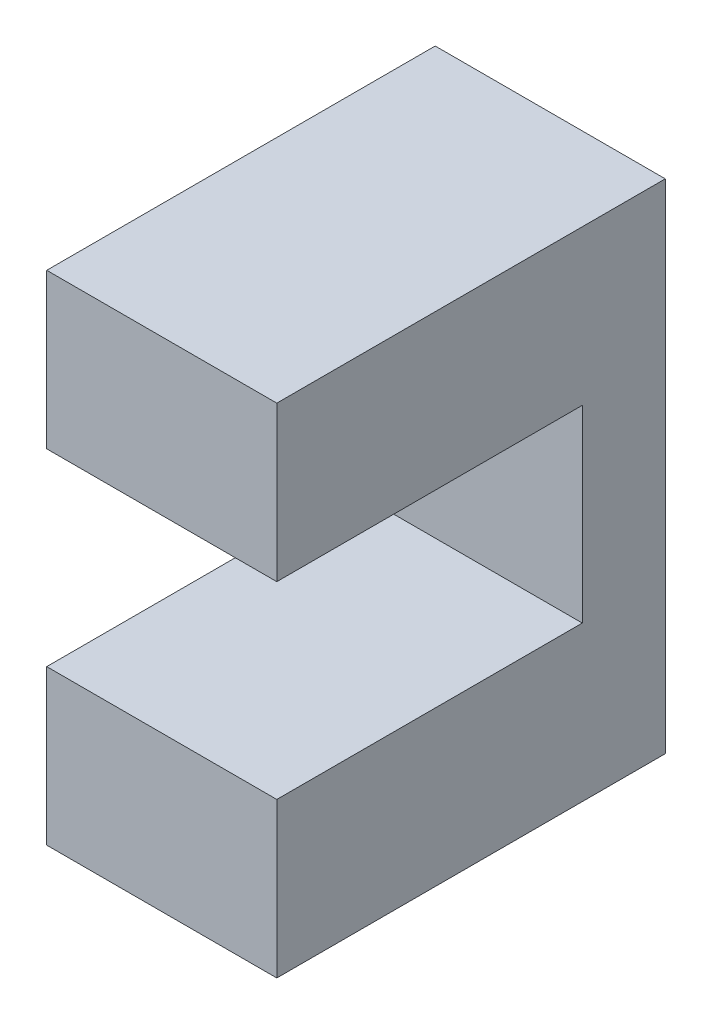
ISO-10303-21;
HEADER;
FILE_DESCRIPTION(('STEP AP214'),'2;1');
FILE_NAME('part.step','',(''),(''),'','','');
FILE_SCHEMA(('AUTOMOTIVE_DESIGN { 1 0 10303 214 1 1 1 1 }'));
ENDSEC;
DATA;
#1=APPLICATION_CONTEXT('core data for automotive mechanical design processes');
#2=APPLICATION_PROTOCOL_DEFINITION('international standard','automotive_design',2000,#1);
#3=PRODUCT_CONTEXT('',#1,'mechanical');
#4=PRODUCT('Part','Part','',(#3));
#5=PRODUCT_RELATED_PRODUCT_CATEGORY('part','',(#4));
#6=PRODUCT_DEFINITION_FORMATION('','',#4);
#7=PRODUCT_DEFINITION_CONTEXT('part definition',#1,'design');
#8=PRODUCT_DEFINITION('design','',#6,#7);
#9=PRODUCT_DEFINITION_SHAPE('','',#8);
#10=(LENGTH_UNIT() NAMED_UNIT(*) SI_UNIT(.MILLI.,.METRE.));
#11=(NAMED_UNIT(*) PLANE_ANGLE_UNIT() SI_UNIT($,.RADIAN.));
#12=(NAMED_UNIT(*) SI_UNIT($,.STERADIAN.) SOLID_ANGLE_UNIT());
#13=UNCERTAINTY_MEASURE_WITH_UNIT(LENGTH_MEASURE(1.E-05),#10,'distance_accuracy_value','');
#14=(GEOMETRIC_REPRESENTATION_CONTEXT(3) GLOBAL_UNCERTAINTY_ASSIGNED_CONTEXT((#13)) GLOBAL_UNIT_ASSIGNED_CONTEXT((#10,
#11,#12)) REPRESENTATION_CONTEXT('',''));
#15=CARTESIAN_POINT('',(0.,0.,0.));
#16=DIRECTION('',(0.,0.,1.));
#17=DIRECTION('',(1.,0.,0.));
#18=AXIS2_PLACEMENT_3D('',#15,#16,#17);
#19=CARTESIAN_POINT('',(-8.59,-6.61,0.));
#20=DIRECTION('',(0.,0.,-1.));
#21=DIRECTION('',(-1.,0.,0.));
#22=AXIS2_PLACEMENT_3D('',#19,#20,#21);
#23=PLANE('',#22);
#24=DIRECTION('',(0.,1.,0.));
#25=VECTOR('',#24,1.);
#26=CARTESIAN_POINT('',(-8.6,0.,0.));
#27=LINE('',#26,#25);
#28=CARTESIAN_POINT('',(-8.6,-6.6,0.));
#29=VERTEX_POINT('',#28);
#30=CARTESIAN_POINT('',(-8.6,6.6,0.));
#31=VERTEX_POINT('',#30);
#32=EDGE_CURVE('E80',#29,#31,#27,.T.);
#33=ORIENTED_EDGE('',*,*,#32,.F.);
#34=DIRECTION('',(1.,0.,0.));
#35=VECTOR('',#34,1.);
#36=CARTESIAN_POINT('',(-11.65,-6.6,0.));
#37=LINE('',#36,#35);
#38=CARTESIAN_POINT('',(-14.7,-6.6,0.));
#39=VERTEX_POINT('',#38);
#40=EDGE_CURVE('E21',#39,#29,#37,.T.);
#41=ORIENTED_EDGE('',*,*,#40,.F.);
#42=DIRECTION('',(0.,-1.,0.));
#43=VECTOR('',#42,1.);
#44=CARTESIAN_POINT('',(-14.7,0.,0.));
#45=LINE('',#44,#43);
#46=CARTESIAN_POINT('',(-14.7,6.6,0.));
#47=VERTEX_POINT('',#46);
#48=EDGE_CURVE('E86',#47,#39,#45,.T.);
#49=ORIENTED_EDGE('',*,*,#48,.F.);
#50=DIRECTION('',(-1.,0.,0.));
#51=VECTOR('',#50,1.);
#52=CARTESIAN_POINT('',(-11.65,6.6,0.));
#53=LINE('',#52,#51);
#54=EDGE_CURVE('E83',#31,#47,#53,.T.);
#55=ORIENTED_EDGE('',*,*,#54,.F.);
#56=EDGE_LOOP('',(#33,#41,#49,#55));
#57=FACE_BOUND('',#56,.T.);
#58=ADVANCED_FACE('F17',(#57),#23,.T.);
#59=CARTESIAN_POINT('',(-14.71,-6.6,-0.01));
#60=DIRECTION('',(0.,-1.,0.));
#61=DIRECTION('',(1.,0.,0.));
#62=AXIS2_PLACEMENT_3D('',#59,#60,#61);
#63=PLANE('',#62);
#64=DIRECTION('',(1.,0.,0.));
#65=VECTOR('',#64,1.);
#66=CARTESIAN_POINT('',(-11.65,-6.6,10.3));
#67=LINE('',#66,#65);
#68=CARTESIAN_POINT('',(-14.7,-6.6,10.3));
#69=VERTEX_POINT('',#68);
#70=CARTESIAN_POINT('',(-8.6,-6.6,10.3));
#71=VERTEX_POINT('',#70);
#72=EDGE_CURVE('E103',#69,#71,#67,.T.);
#73=ORIENTED_EDGE('',*,*,#72,.F.);
#74=DIRECTION('',(0.,0.,1.));
#75=VECTOR('',#74,1.);
#76=CARTESIAN_POINT('',(-14.7,-6.6,5.15));
#77=LINE('',#76,#75);
#78=EDGE_CURVE('E118',#39,#69,#77,.T.);
#79=ORIENTED_EDGE('',*,*,#78,.F.);
#80=ORIENTED_EDGE('',*,*,#40,.T.);
#81=DIRECTION('',(0.,0.,-1.));
#82=VECTOR('',#81,1.);
#83=CARTESIAN_POINT('',(-8.6,-6.6,5.15));
#84=LINE('',#83,#82);
#85=EDGE_CURVE('E102',#71,#29,#84,.T.);
#86=ORIENTED_EDGE('',*,*,#85,.F.);
#87=EDGE_LOOP('',(#73,#79,#80,#86));
#88=FACE_BOUND('',#87,.T.);
#89=ADVANCED_FACE('F158',(#88),#63,.T.);
#90=CARTESIAN_POINT('',(-14.71,2.49,10.3));
#91=DIRECTION('',(0.,0.,1.));
#92=DIRECTION('',(1.,0.,0.));
#93=AXIS2_PLACEMENT_3D('',#90,#91,#92);
#94=PLANE('',#93);
#95=DIRECTION('',(0.,-1.,0.));
#96=VECTOR('',#95,1.);
#97=CARTESIAN_POINT('',(-8.6,0.,10.3));
#98=LINE('',#97,#96);
#99=CARTESIAN_POINT('',(-8.6,6.6,10.3));
#100=VERTEX_POINT('',#99);
#101=CARTESIAN_POINT('',(-8.6,2.5,10.3));
#102=VERTEX_POINT('',#101);
#103=EDGE_CURVE('E96',#100,#102,#98,.T.);
#104=ORIENTED_EDGE('',*,*,#103,.F.);
#105=DIRECTION('',(1.,0.,0.));
#106=VECTOR('',#105,1.);
#107=CARTESIAN_POINT('',(-11.65,6.6,10.3));
#108=LINE('',#107,#106);
#109=CARTESIAN_POINT('',(-14.7,6.6,10.3));
#110=VERTEX_POINT('',#109);
#111=EDGE_CURVE('E90',#110,#100,#108,.T.);
#112=ORIENTED_EDGE('',*,*,#111,.F.);
#113=DIRECTION('',(0.,1.,0.));
#114=VECTOR('',#113,1.);
#115=CARTESIAN_POINT('',(-14.7,0.,10.3));
#116=LINE('',#115,#114);
#117=CARTESIAN_POINT('',(-14.7,2.5,10.3));
#118=VERTEX_POINT('',#117);
#119=EDGE_CURVE('E126',#118,#110,#116,.T.);
#120=ORIENTED_EDGE('',*,*,#119,.F.);
#121=DIRECTION('',(-1.,0.,0.));
#122=VECTOR('',#121,1.);
#123=CARTESIAN_POINT('',(-11.65,2.5,10.3));
#124=LINE('',#123,#122);
#125=EDGE_CURVE('E115',#102,#118,#124,.T.);
#126=ORIENTED_EDGE('',*,*,#125,.F.);
#127=EDGE_LOOP('',(#104,#112,#120,#126));
#128=FACE_BOUND('',#127,.T.);
#129=ADVANCED_FACE('F153',(#128),#94,.T.);
#130=CARTESIAN_POINT('',(-8.59,6.6,-0.01));
#131=DIRECTION('',(0.,1.,0.));
#132=DIRECTION('',(-1.,0.,0.));
#133=AXIS2_PLACEMENT_3D('',#130,#131,#132);
#134=PLANE('',#133);
#135=ORIENTED_EDGE('',*,*,#111,.T.);
#136=DIRECTION('',(0.,0.,1.));
#137=VECTOR('',#136,1.);
#138=CARTESIAN_POINT('',(-8.6,6.6,5.15));
#139=LINE('',#138,#137);
#140=EDGE_CURVE('E92',#31,#100,#139,.T.);
#141=ORIENTED_EDGE('',*,*,#140,.F.);
#142=ORIENTED_EDGE('',*,*,#54,.T.);
#143=DIRECTION('',(0.,0.,-1.));
#144=VECTOR('',#143,1.);
#145=CARTESIAN_POINT('',(-14.7,6.6,5.15));
#146=LINE('',#145,#144);
#147=EDGE_CURVE('E129',#110,#47,#146,.T.);
#148=ORIENTED_EDGE('',*,*,#147,.F.);
#149=EDGE_LOOP('',(#135,#141,#142,#148));
#150=FACE_BOUND('',#149,.T.);
#151=ADVANCED_FACE('F93',(#150),#134,.T.);
#152=CARTESIAN_POINT('',(-14.71,-6.61,10.3));
#153=DIRECTION('',(0.,0.,1.));
#154=DIRECTION('',(1.,0.,0.));
#155=AXIS2_PLACEMENT_3D('',#152,#153,#154);
#156=PLANE('',#155);
#157=DIRECTION('',(0.,1.,0.));
#158=VECTOR('',#157,1.);
#159=CARTESIAN_POINT('',(-14.7,0.,10.3));
#160=LINE('',#159,#158);
#161=CARTESIAN_POINT('',(-14.7,-2.5,10.3));
#162=VERTEX_POINT('',#161);
#163=EDGE_CURVE('E121',#69,#162,#160,.T.);
#164=ORIENTED_EDGE('',*,*,#163,.F.);
#165=ORIENTED_EDGE('',*,*,#72,.T.);
#166=DIRECTION('',(0.,-1.,0.));
#167=VECTOR('',#166,1.);
#168=CARTESIAN_POINT('',(-8.6,0.,10.3));
#169=LINE('',#168,#167);
#170=CARTESIAN_POINT('',(-8.6,-2.5,10.3));
#171=VERTEX_POINT('',#170);
#172=EDGE_CURVE('E109',#171,#71,#169,.T.);
#173=ORIENTED_EDGE('',*,*,#172,.F.);
#174=DIRECTION('',(1.,0.,0.));
#175=VECTOR('',#174,1.);
#176=CARTESIAN_POINT('',(-11.65,-2.5,10.3));
#177=LINE('',#176,#175);
#178=EDGE_CURVE('E132',#162,#171,#177,.T.);
#179=ORIENTED_EDGE('',*,*,#178,.F.);
#180=EDGE_LOOP('',(#164,#165,#173,#179));
#181=FACE_BOUND('',#180,.T.);
#182=ADVANCED_FACE('F160',(#181),#156,.T.);
#183=CARTESIAN_POINT('',(-8.6,-6.61,-0.01));
#184=DIRECTION('',(1.,0.,0.));
#185=DIRECTION('',(0.,1.,0.));
#186=AXIS2_PLACEMENT_3D('',#183,#184,#185);
#187=PLANE('',#186);
#188=ORIENTED_EDGE('',*,*,#172,.T.);
#189=ORIENTED_EDGE('',*,*,#85,.T.);
#190=ORIENTED_EDGE('',*,*,#32,.T.);
#191=ORIENTED_EDGE('',*,*,#140,.T.);
#192=ORIENTED_EDGE('',*,*,#103,.T.);
#193=DIRECTION('',(0.,0.,1.));
#194=VECTOR('',#193,1.);
#195=CARTESIAN_POINT('',(-8.6,2.5,6.25));
#196=LINE('',#195,#194);
#197=CARTESIAN_POINT('',(-8.6,2.5,2.2));
#198=VERTEX_POINT('',#197);
#199=EDGE_CURVE('E112',#198,#102,#196,.T.);
#200=ORIENTED_EDGE('',*,*,#199,.F.);
#201=DIRECTION('',(0.,1.,0.));
#202=VECTOR('',#201,1.);
#203=CARTESIAN_POINT('',(-8.6,0.,2.2));
#204=LINE('',#203,#202);
#205=CARTESIAN_POINT('',(-8.6,-2.5,2.2));
#206=VERTEX_POINT('',#205);
#207=EDGE_CURVE('E138',#206,#198,#204,.T.);
#208=ORIENTED_EDGE('',*,*,#207,.F.);
#209=DIRECTION('',(0.,0.,-1.));
#210=VECTOR('',#209,1.);
#211=CARTESIAN_POINT('',(-8.6,-2.5,6.25));
#212=LINE('',#211,#210);
#213=EDGE_CURVE('E135',#171,#206,#212,.T.);
#214=ORIENTED_EDGE('',*,*,#213,.F.);
#215=EDGE_LOOP('',(#188,#189,#190,#191,#192,#200,#208,#214));
#216=FACE_BOUND('',#215,.T.);
#217=ADVANCED_FACE('F100',(#216),#187,.T.);
#218=CARTESIAN_POINT('',(-14.71,2.5,2.19));
#219=DIRECTION('',(0.,-1.,0.));
#220=DIRECTION('',(1.,0.,0.));
#221=AXIS2_PLACEMENT_3D('',#218,#219,#220);
#222=PLANE('',#221);
#223=ORIENTED_EDGE('',*,*,#125,.T.);
#224=DIRECTION('',(0.,0.,1.));
#225=VECTOR('',#224,1.);
#226=CARTESIAN_POINT('',(-14.7,2.5,5.15));
#227=LINE('',#226,#225);
#228=CARTESIAN_POINT('',(-14.7,2.5,2.2));
#229=VERTEX_POINT('',#228);
#230=EDGE_CURVE('E123',#229,#118,#227,.T.);
#231=ORIENTED_EDGE('',*,*,#230,.F.);
#232=DIRECTION('',(-1.,0.,0.));
#233=VECTOR('',#232,1.);
#234=CARTESIAN_POINT('',(-11.65,2.5,2.2));
#235=LINE('',#234,#233);
#236=EDGE_CURVE('E141',#198,#229,#235,.T.);
#237=ORIENTED_EDGE('',*,*,#236,.F.);
#238=ORIENTED_EDGE('',*,*,#199,.T.);
#239=EDGE_LOOP('',(#223,#231,#237,#238));
#240=FACE_BOUND('',#239,.T.);
#241=ADVANCED_FACE('F150',(#240),#222,.T.);
#242=CARTESIAN_POINT('',(-14.7,6.61,-0.01));
#243=DIRECTION('',(-1.,0.,0.));
#244=DIRECTION('',(0.,-1.,0.));
#245=AXIS2_PLACEMENT_3D('',#242,#243,#244);
#246=PLANE('',#245);
#247=ORIENTED_EDGE('',*,*,#119,.T.);
#248=ORIENTED_EDGE('',*,*,#147,.T.);
#249=ORIENTED_EDGE('',*,*,#48,.T.);
#250=ORIENTED_EDGE('',*,*,#78,.T.);
#251=ORIENTED_EDGE('',*,*,#163,.T.);
#252=DIRECTION('',(0.,0.,1.));
#253=VECTOR('',#252,1.);
#254=CARTESIAN_POINT('',(-14.7,-2.5,6.25));
#255=LINE('',#254,#253);
#256=CARTESIAN_POINT('',(-14.7,-2.5,2.2));
#257=VERTEX_POINT('',#256);
#258=EDGE_CURVE('E36',#257,#162,#255,.T.);
#259=ORIENTED_EDGE('',*,*,#258,.F.);
#260=DIRECTION('',(0.,-1.,0.));
#261=VECTOR('',#260,1.);
#262=CARTESIAN_POINT('',(-14.7,0.,2.2));
#263=LINE('',#262,#261);
#264=EDGE_CURVE('E27',#229,#257,#263,.T.);
#265=ORIENTED_EDGE('',*,*,#264,.F.);
#266=ORIENTED_EDGE('',*,*,#230,.T.);
#267=EDGE_LOOP('',(#247,#248,#249,#250,#251,#259,#265,#266));
#268=FACE_BOUND('',#267,.T.);
#269=ADVANCED_FACE('F147',(#268),#246,.T.);
#270=CARTESIAN_POINT('',(-8.59,-2.5,2.19));
#271=DIRECTION('',(0.,1.,0.));
#272=DIRECTION('',(-1.,0.,0.));
#273=AXIS2_PLACEMENT_3D('',#270,#271,#272);
#274=PLANE('',#273);
#275=ORIENTED_EDGE('',*,*,#178,.T.);
#276=ORIENTED_EDGE('',*,*,#213,.T.);
#277=DIRECTION('',(1.,0.,0.));
#278=VECTOR('',#277,1.);
#279=CARTESIAN_POINT('',(-11.65,-2.5,2.2));
#280=LINE('',#279,#278);
#281=EDGE_CURVE('E11',#257,#206,#280,.T.);
#282=ORIENTED_EDGE('',*,*,#281,.F.);
#283=ORIENTED_EDGE('',*,*,#258,.T.);
#284=EDGE_LOOP('',(#275,#276,#282,#283));
#285=FACE_BOUND('',#284,.T.);
#286=ADVANCED_FACE('F163',(#285),#274,.T.);
#287=CARTESIAN_POINT('',(-14.71,-2.51,2.2));
#288=DIRECTION('',(0.,0.,1.));
#289=DIRECTION('',(1.,0.,0.));
#290=AXIS2_PLACEMENT_3D('',#287,#288,#289);
#291=PLANE('',#290);
#292=ORIENTED_EDGE('',*,*,#264,.T.);
#293=ORIENTED_EDGE('',*,*,#281,.T.);
#294=ORIENTED_EDGE('',*,*,#207,.T.);
#295=ORIENTED_EDGE('',*,*,#236,.T.);
#296=EDGE_LOOP('',(#292,#293,#294,#295));
#297=FACE_BOUND('',#296,.T.);
#298=ADVANCED_FACE('F19',(#297),#291,.T.);
#299=CLOSED_SHELL('',(#58,#89,#129,#151,#182,#217,#241,#269,#286,#298));
#300=MANIFOLD_SOLID_BREP('B1',#299);
#301=ADVANCED_BREP_SHAPE_REPRESENTATION('',(#18,#300),#14);
#302=SHAPE_DEFINITION_REPRESENTATION(#9,#301);
ENDSEC;
END-ISO-10303-21;
